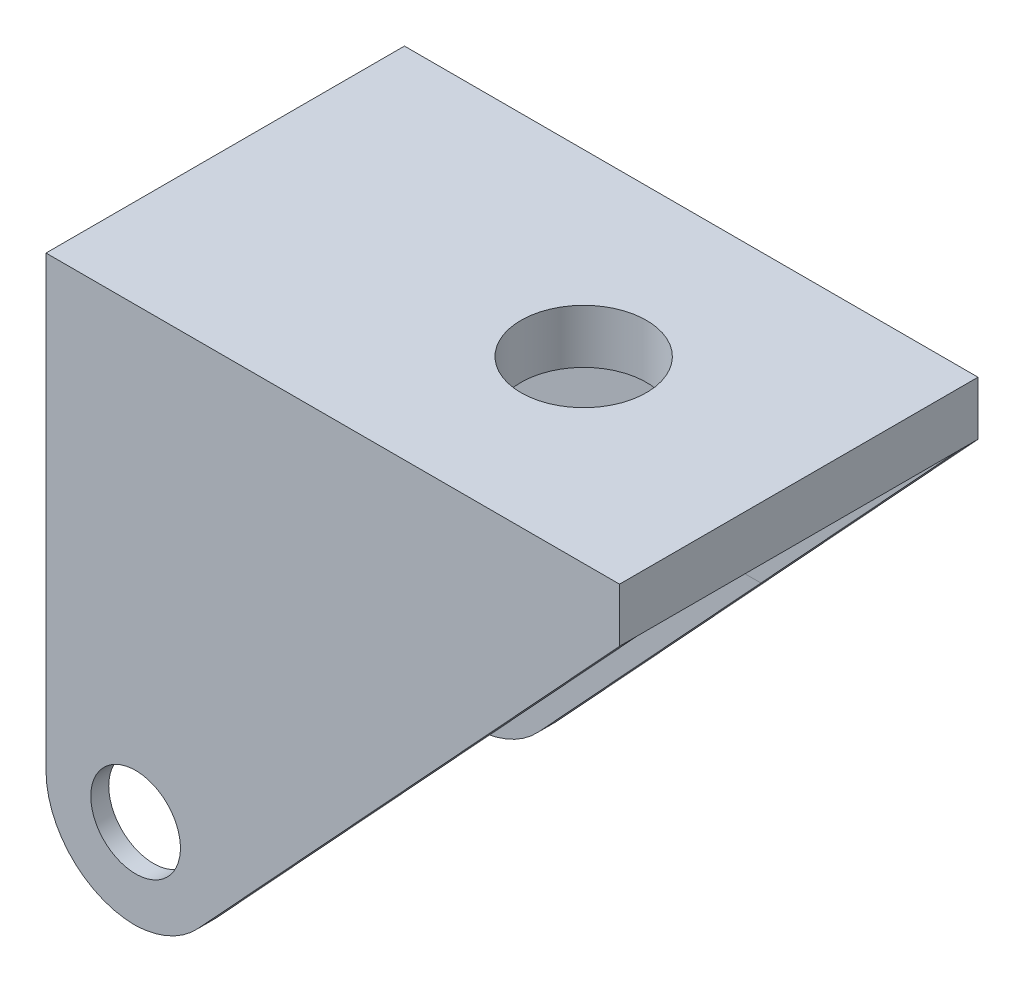
ISO-10303-21;
HEADER;
FILE_DESCRIPTION(('STEP AP214'),'2;1');
FILE_NAME('part.step','',(''),(''),'','','');
FILE_SCHEMA(('AUTOMOTIVE_DESIGN { 1 0 10303 214 1 1 1 1 }'));
ENDSEC;
DATA;
#1=APPLICATION_CONTEXT('core data for automotive mechanical design processes');
#2=APPLICATION_PROTOCOL_DEFINITION('international standard','automotive_design',2000,#1);
#3=PRODUCT_CONTEXT('',#1,'mechanical');
#4=PRODUCT('Part','Part','',(#3));
#5=PRODUCT_RELATED_PRODUCT_CATEGORY('part','',(#4));
#6=PRODUCT_DEFINITION_FORMATION('','',#4);
#7=PRODUCT_DEFINITION_CONTEXT('part definition',#1,'design');
#8=PRODUCT_DEFINITION('design','',#6,#7);
#9=PRODUCT_DEFINITION_SHAPE('','',#8);
#10=(LENGTH_UNIT() NAMED_UNIT(*) SI_UNIT(.MILLI.,.METRE.));
#11=(NAMED_UNIT(*) PLANE_ANGLE_UNIT() SI_UNIT($,.RADIAN.));
#12=(NAMED_UNIT(*) SI_UNIT($,.STERADIAN.) SOLID_ANGLE_UNIT());
#13=UNCERTAINTY_MEASURE_WITH_UNIT(LENGTH_MEASURE(1.E-05),#10,'distance_accuracy_value','');
#14=(GEOMETRIC_REPRESENTATION_CONTEXT(3) GLOBAL_UNCERTAINTY_ASSIGNED_CONTEXT((#13)) GLOBAL_UNIT_ASSIGNED_CONTEXT((#10,
#11,#12)) REPRESENTATION_CONTEXT('',''));
#15=CARTESIAN_POINT('',(0.,0.,0.));
#16=DIRECTION('',(0.,0.,1.));
#17=DIRECTION('',(1.,0.,0.));
#18=AXIS2_PLACEMENT_3D('',#15,#16,#17);
#19=CARTESIAN_POINT('',(16.,0.,0.));
#20=DIRECTION('',(1.,0.,0.));
#21=DIRECTION('',(0.,0.,-1.));
#22=AXIS2_PLACEMENT_3D('',#19,#20,#21);
#23=PLANE('',#22);
#24=DIRECTION('',(0.,0.,1.));
#25=VECTOR('',#24,1.);
#26=CARTESIAN_POINT('',(16.,12.,-94.0098539659698));
#27=LINE('',#26,#25);
#28=CARTESIAN_POINT('',(16.,12.,-9.99999999999999));
#29=VERTEX_POINT('',#28);
#30=CARTESIAN_POINT('',(16.,12.,-8.99999999999999));
#31=VERTEX_POINT('',#30);
#32=EDGE_CURVE('E129',#29,#31,#27,.T.);
#33=ORIENTED_EDGE('',*,*,#32,.F.);
#34=DIRECTION('',(0.,1.,0.));
#35=VECTOR('',#34,1.);
#36=CARTESIAN_POINT('',(16.,-15.,-10.));
#37=LINE('',#36,#35);
#38=CARTESIAN_POINT('',(16.,15.,-10.));
#39=VERTEX_POINT('',#38);
#40=EDGE_CURVE('E141',#29,#39,#37,.T.);
#41=ORIENTED_EDGE('',*,*,#40,.T.);
#42=DIRECTION('',(0.,0.,1.));
#43=VECTOR('',#42,1.);
#44=CARTESIAN_POINT('',(16.,15.,-10.));
#45=LINE('',#44,#43);
#46=CARTESIAN_POINT('',(16.,15.,10.));
#47=VERTEX_POINT('',#46);
#48=EDGE_CURVE('E153',#39,#47,#45,.T.);
#49=ORIENTED_EDGE('',*,*,#48,.T.);
#50=DIRECTION('',(0.,-1.,0.));
#51=VECTOR('',#50,1.);
#52=CARTESIAN_POINT('',(16.,-15.,10.));
#53=LINE('',#52,#51);
#54=CARTESIAN_POINT('',(16.,12.,10.));
#55=VERTEX_POINT('',#54);
#56=EDGE_CURVE('E154',#47,#55,#53,.T.);
#57=ORIENTED_EDGE('',*,*,#56,.T.);
#58=CARTESIAN_POINT('',(16.,12.,8.99999999999999));
#59=VERTEX_POINT('',#58);
#60=EDGE_CURVE('E147',#59,#55,#27,.T.);
#61=ORIENTED_EDGE('',*,*,#60,.F.);
#62=DIRECTION('',(0.,0.,-1.));
#63=VECTOR('',#62,1.);
#64=CARTESIAN_POINT('',(16.,12.,-9.));
#65=LINE('',#64,#63);
#66=EDGE_CURVE('E145',#59,#31,#65,.T.);
#67=ORIENTED_EDGE('',*,*,#66,.T.);
#68=EDGE_LOOP('',(#33,#41,#49,#57,#61,#67));
#69=FACE_BOUND('',#68,.T.);
#70=ADVANCED_FACE('F32',(#69),#23,.T.);
#71=CARTESIAN_POINT('',(16.,-15.,10.));
#72=DIRECTION('',(0.,0.,-1.));
#73=DIRECTION('',(-1.,0.,0.));
#74=AXIS2_PLACEMENT_3D('',#71,#72,#73);
#75=PLANE('',#74);
#76=CARTESIAN_POINT('',(-11.,-10.,10.));
#77=DIRECTION('',(0.,0.,-1.));
#78=DIRECTION('',(-1.,0.,0.));
#79=AXIS2_PLACEMENT_3D('',#76,#77,#78);
#80=CIRCLE('',#79,2.5);
#81=CARTESIAN_POINT('',(-13.5,-10.,10.));
#82=VERTEX_POINT('',#81);
#83=EDGE_CURVE('E180',#82,#82,#80,.T.);
#84=ORIENTED_EDGE('',*,*,#83,.T.);
#85=EDGE_LOOP('',(#84));
#86=FACE_BOUND('',#85,.T.);
#87=CARTESIAN_POINT('',(-11.,-10.,10.));
#88=DIRECTION('',(0.,0.,-1.));
#89=DIRECTION('',(-1.,0.,0.));
#90=AXIS2_PLACEMENT_3D('',#87,#88,#89);
#91=CIRCLE('',#90,5.);
#92=CARTESIAN_POINT('',(-16.,-10.,10.));
#93=VERTEX_POINT('',#92);
#94=CARTESIAN_POINT('',(-11.,-15.,10.));
#95=VERTEX_POINT('',#94);
#96=EDGE_CURVE('E202',#93,#95,#91,.F.);
#97=ORIENTED_EDGE('',*,*,#96,.T.);
#98=CARTESIAN_POINT('',(-11.1878498134461,-10.0035300013321,10.));
#99=DIRECTION('',(0.,0.,-1.));
#100=DIRECTION('',(-1.,0.,0.));
#101=AXIS2_PLACEMENT_3D('',#98,#99,#100);
#102=CIRCLE('',#101,5.);
#103=CARTESIAN_POINT('',(-7.51904644335522,-13.4005701588236,10.));
#104=VERTEX_POINT('',#103);
#105=EDGE_CURVE('E54',#95,#104,#102,.F.);
#106=ORIENTED_EDGE('',*,*,#105,.T.);
#107=DIRECTION('',(0.679408031498305,0.733760674018169,0.));
#108=VECTOR('',#107,1.);
#109=CARTESIAN_POINT('',(2.53988183161004,-2.53692762186115,10.));
#110=LINE('',#109,#108);
#111=EDGE_CURVE('E136',#104,#55,#110,.T.);
#112=ORIENTED_EDGE('',*,*,#111,.T.);
#113=ORIENTED_EDGE('',*,*,#56,.F.);
#114=DIRECTION('',(-1.,0.,0.));
#115=VECTOR('',#114,1.);
#116=CARTESIAN_POINT('',(16.,15.,10.));
#117=LINE('',#116,#115);
#118=CARTESIAN_POINT('',(-16.,15.,10.));
#119=VERTEX_POINT('',#118);
#120=EDGE_CURVE('E156',#47,#119,#117,.T.);
#121=ORIENTED_EDGE('',*,*,#120,.T.);
#122=DIRECTION('',(0.,-1.,0.));
#123=VECTOR('',#122,1.);
#124=CARTESIAN_POINT('',(-16.,-15.,10.));
#125=LINE('',#124,#123);
#126=EDGE_CURVE('E163',#119,#93,#125,.T.);
#127=ORIENTED_EDGE('',*,*,#126,.T.);
#128=EDGE_LOOP('',(#97,#106,#112,#113,#121,#127));
#129=FACE_BOUND('',#128,.T.);
#130=ADVANCED_FACE('F206',(#86,#129),#75,.F.);
#131=CARTESIAN_POINT('',(16.,-15.,-10.));
#132=DIRECTION('',(0.,0.,1.));
#133=DIRECTION('',(1.,0.,0.));
#134=AXIS2_PLACEMENT_3D('',#131,#132,#133);
#135=PLANE('',#134);
#136=CARTESIAN_POINT('',(-11.,-10.,-10.));
#137=DIRECTION('',(0.,0.,-1.));
#138=DIRECTION('',(-1.,0.,0.));
#139=AXIS2_PLACEMENT_3D('',#136,#137,#138);
#140=CIRCLE('',#139,2.5);
#141=CARTESIAN_POINT('',(-13.5,-10.,-10.));
#142=VERTEX_POINT('',#141);
#143=EDGE_CURVE('E262',#142,#142,#140,.T.);
#144=ORIENTED_EDGE('',*,*,#143,.F.);
#145=EDGE_LOOP('',(#144));
#146=FACE_BOUND('',#145,.T.);
#147=DIRECTION('',(-0.679408031498305,-0.733760674018169,0.));
#148=VECTOR('',#147,1.);
#149=CARTESIAN_POINT('',(2.53988183161005,-2.53692762186115,-10.));
#150=LINE('',#149,#148);
#151=CARTESIAN_POINT('',(-7.51904644335522,-13.4005701588236,-10.));
#152=VERTEX_POINT('',#151);
#153=EDGE_CURVE('E124',#29,#152,#150,.T.);
#154=ORIENTED_EDGE('',*,*,#153,.T.);
#155=CARTESIAN_POINT('',(-11.1878498134461,-10.0035300013321,-10.));
#156=DIRECTION('',(0.,0.,1.));
#157=DIRECTION('',(1.,0.,0.));
#158=AXIS2_PLACEMENT_3D('',#155,#156,#157);
#159=CIRCLE('',#158,5.);
#160=CARTESIAN_POINT('',(-11.,-15.,-10.));
#161=VERTEX_POINT('',#160);
#162=EDGE_CURVE('E193',#152,#161,#159,.F.);
#163=ORIENTED_EDGE('',*,*,#162,.T.);
#164=CARTESIAN_POINT('',(-11.,-9.99999999999999,-10.));
#165=DIRECTION('',(0.,0.,1.));
#166=DIRECTION('',(1.,0.,0.));
#167=AXIS2_PLACEMENT_3D('',#164,#165,#166);
#168=CIRCLE('',#167,5.);
#169=CARTESIAN_POINT('',(-16.,-9.99999999999999,-10.));
#170=VERTEX_POINT('',#169);
#171=EDGE_CURVE('E183',#161,#170,#168,.F.);
#172=ORIENTED_EDGE('',*,*,#171,.T.);
#173=DIRECTION('',(0.,1.,0.));
#174=VECTOR('',#173,1.);
#175=CARTESIAN_POINT('',(-16.,-15.,-10.));
#176=LINE('',#175,#174);
#177=CARTESIAN_POINT('',(-16.,15.,-10.));
#178=VERTEX_POINT('',#177);
#179=EDGE_CURVE('E166',#170,#178,#176,.T.);
#180=ORIENTED_EDGE('',*,*,#179,.T.);
#181=DIRECTION('',(-1.,0.,0.));
#182=VECTOR('',#181,1.);
#183=CARTESIAN_POINT('',(16.,15.,-10.));
#184=LINE('',#183,#182);
#185=EDGE_CURVE('E151',#39,#178,#184,.T.);
#186=ORIENTED_EDGE('',*,*,#185,.F.);
#187=ORIENTED_EDGE('',*,*,#40,.F.);
#188=EDGE_LOOP('',(#154,#163,#172,#180,#186,#187));
#189=FACE_BOUND('',#188,.T.);
#190=ADVANCED_FACE('F149',(#146,#189),#135,.F.);
#191=CARTESIAN_POINT('',(16.,15.,-10.));
#192=DIRECTION('',(0.,-1.,0.));
#193=DIRECTION('',(0.,0.,-1.));
#194=AXIS2_PLACEMENT_3D('',#191,#192,#193);
#195=PLANE('',#194);
#196=CARTESIAN_POINT('',(4.,15.,0.));
#197=DIRECTION('',(0.,1.,0.));
#198=DIRECTION('',(0.,0.,1.));
#199=AXIS2_PLACEMENT_3D('',#196,#197,#198);
#200=CIRCLE('',#199,3.5);
#201=CARTESIAN_POINT('',(4.,15.,3.50000000000001));
#202=VERTEX_POINT('',#201);
#203=EDGE_CURVE('E270',#202,#202,#200,.T.);
#204=ORIENTED_EDGE('',*,*,#203,.F.);
#205=EDGE_LOOP('',(#204));
#206=FACE_BOUND('',#205,.T.);
#207=DIRECTION('',(0.,0.,1.));
#208=VECTOR('',#207,1.);
#209=CARTESIAN_POINT('',(-16.,15.,-10.));
#210=LINE('',#209,#208);
#211=EDGE_CURVE('E159',#178,#119,#210,.T.);
#212=ORIENTED_EDGE('',*,*,#211,.T.);
#213=ORIENTED_EDGE('',*,*,#120,.F.);
#214=ORIENTED_EDGE('',*,*,#48,.F.);
#215=ORIENTED_EDGE('',*,*,#185,.T.);
#216=EDGE_LOOP('',(#212,#213,#214,#215));
#217=FACE_BOUND('',#216,.T.);
#218=ADVANCED_FACE('F277',(#206,#217),#195,.F.);
#219=CARTESIAN_POINT('',(-16.,0.,0.));
#220=DIRECTION('',(1.,0.,0.));
#221=DIRECTION('',(0.,0.,-1.));
#222=AXIS2_PLACEMENT_3D('',#219,#220,#221);
#223=PLANE('',#222);
#224=DIRECTION('',(0.,1.,0.));
#225=VECTOR('',#224,1.);
#226=CARTESIAN_POINT('',(-16.,0.,9.));
#227=LINE('',#226,#225);
#228=CARTESIAN_POINT('',(-16.,-10.,9.));
#229=VERTEX_POINT('',#228);
#230=CARTESIAN_POINT('',(-16.,0.,9.));
#231=VERTEX_POINT('',#230);
#232=EDGE_CURVE('E226',#229,#231,#227,.T.);
#233=ORIENTED_EDGE('',*,*,#232,.F.);
#234=DIRECTION('',(0.,0.,-1.));
#235=VECTOR('',#234,1.);
#236=CARTESIAN_POINT('',(-16.,-10.,0.));
#237=LINE('',#236,#235);
#238=EDGE_CURVE('E200',#229,#93,#237,.F.);
#239=ORIENTED_EDGE('',*,*,#238,.T.);
#240=ORIENTED_EDGE('',*,*,#126,.F.);
#241=ORIENTED_EDGE('',*,*,#211,.F.);
#242=ORIENTED_EDGE('',*,*,#179,.F.);
#243=DIRECTION('',(0.,0.,-1.));
#244=VECTOR('',#243,1.);
#245=CARTESIAN_POINT('',(-16.,-10.,0.));
#246=LINE('',#245,#244);
#247=CARTESIAN_POINT('',(-16.,-9.99999999999999,-9.));
#248=VERTEX_POINT('',#247);
#249=EDGE_CURVE('E185',#170,#248,#246,.F.);
#250=ORIENTED_EDGE('',*,*,#249,.T.);
#251=DIRECTION('',(0.,-1.,0.));
#252=VECTOR('',#251,1.);
#253=CARTESIAN_POINT('',(-16.,0.,-9.));
#254=LINE('',#253,#252);
#255=CARTESIAN_POINT('',(-16.,0.,-9.));
#256=VERTEX_POINT('',#255);
#257=EDGE_CURVE('E229',#256,#248,#254,.T.);
#258=ORIENTED_EDGE('',*,*,#257,.F.);
#259=DIRECTION('',(0.,-1.,0.));
#260=VECTOR('',#259,1.);
#261=CARTESIAN_POINT('',(-16.,0.,-9.));
#262=LINE('',#261,#260);
#263=CARTESIAN_POINT('',(-16.,12.,-9.));
#264=VERTEX_POINT('',#263);
#265=EDGE_CURVE('E237',#264,#256,#262,.T.);
#266=ORIENTED_EDGE('',*,*,#265,.F.);
#267=DIRECTION('',(0.,0.,-1.));
#268=VECTOR('',#267,1.);
#269=CARTESIAN_POINT('',(-16.,12.,-9.));
#270=LINE('',#269,#268);
#271=CARTESIAN_POINT('',(-16.,12.,9.));
#272=VERTEX_POINT('',#271);
#273=EDGE_CURVE('E234',#272,#264,#270,.T.);
#274=ORIENTED_EDGE('',*,*,#273,.F.);
#275=DIRECTION('',(0.,1.,0.));
#276=VECTOR('',#275,1.);
#277=CARTESIAN_POINT('',(-16.,12.,9.));
#278=LINE('',#277,#276);
#279=EDGE_CURVE('E231',#231,#272,#278,.T.);
#280=ORIENTED_EDGE('',*,*,#279,.F.);
#281=EDGE_LOOP('',(#233,#239,#240,#241,#242,#250,#258,#266,#274,#280));
#282=FACE_BOUND('',#281,.T.);
#283=ADVANCED_FACE('F280',(#282),#223,.F.);
#284=CARTESIAN_POINT('',(-76.2598539659698,0.,9.));
#285=DIRECTION('',(0.,0.,1.));
#286=DIRECTION('',(1.,0.,0.));
#287=AXIS2_PLACEMENT_3D('',#284,#285,#286);
#288=PLANE('',#287);
#289=CARTESIAN_POINT('',(-11.,-10.,9.));
#290=DIRECTION('',(0.,0.,1.));
#291=DIRECTION('',(1.,0.,0.));
#292=AXIS2_PLACEMENT_3D('',#289,#290,#291);
#293=CIRCLE('',#292,2.5);
#294=CARTESIAN_POINT('',(-13.5,-10.,9.));
#295=VERTEX_POINT('',#294);
#296=EDGE_CURVE('E179',#295,#295,#293,.T.);
#297=ORIENTED_EDGE('',*,*,#296,.T.);
#298=EDGE_LOOP('',(#297));
#299=FACE_BOUND('',#298,.T.);
#300=DIRECTION('',(-0.679408031498305,-0.733760674018169,0.));
#301=VECTOR('',#300,1.);
#302=CARTESIAN_POINT('',(-32.5689872442623,-40.4545062238032,9.));
#303=LINE('',#302,#301);
#304=CARTESIAN_POINT('',(4.88888888888887,0.,9.));
#305=VERTEX_POINT('',#304);
#306=CARTESIAN_POINT('',(-7.51904644335523,-13.4005701588236,9.00000000000001));
#307=VERTEX_POINT('',#306);
#308=EDGE_CURVE('E137',#305,#307,#303,.T.);
#309=ORIENTED_EDGE('',*,*,#308,.T.);
#310=CARTESIAN_POINT('',(-11.1878498134461,-10.0035300013321,9.00000000000001));
#311=DIRECTION('',(0.,0.,1.));
#312=DIRECTION('',(1.,0.,0.));
#313=AXIS2_PLACEMENT_3D('',#310,#311,#312);
#314=CIRCLE('',#313,5.);
#315=CARTESIAN_POINT('',(-11.,-15.,9.));
#316=VERTEX_POINT('',#315);
#317=EDGE_CURVE('E11',#307,#316,#314,.F.);
#318=ORIENTED_EDGE('',*,*,#317,.T.);
#319=CARTESIAN_POINT('',(-11.,-10.,9.));
#320=DIRECTION('',(0.,0.,1.));
#321=DIRECTION('',(1.,0.,0.));
#322=AXIS2_PLACEMENT_3D('',#319,#320,#321);
#323=CIRCLE('',#322,5.);
#324=EDGE_CURVE('E198',#316,#229,#323,.F.);
#325=ORIENTED_EDGE('',*,*,#324,.T.);
#326=ORIENTED_EDGE('',*,*,#232,.T.);
#327=DIRECTION('',(1.,0.,0.));
#328=VECTOR('',#327,1.);
#329=CARTESIAN_POINT('',(-76.2598539659698,0.,9.));
#330=LINE('',#329,#328);
#331=EDGE_CURVE('E167',#231,#305,#330,.T.);
#332=ORIENTED_EDGE('',*,*,#331,.T.);
#333=EDGE_LOOP('',(#309,#318,#325,#326,#332));
#334=FACE_BOUND('',#333,.T.);
#335=ADVANCED_FACE('F215',(#299,#334),#288,.F.);
#336=CARTESIAN_POINT('',(-76.2598539659698,12.,9.));
#337=DIRECTION('',(0.,0.,1.));
#338=DIRECTION('',(0.,-1.,0.));
#339=AXIS2_PLACEMENT_3D('',#336,#337,#338);
#340=PLANE('',#339);
#341=DIRECTION('',(1.,0.,0.));
#342=VECTOR('',#341,1.);
#343=CARTESIAN_POINT('',(-76.2598539659698,12.,9.));
#344=LINE('',#343,#342);
#345=EDGE_CURVE('E246',#272,#59,#344,.T.);
#346=ORIENTED_EDGE('',*,*,#345,.T.);
#347=DIRECTION('',(-0.679408031498305,-0.733760674018169,0.));
#348=VECTOR('',#347,1.);
#349=CARTESIAN_POINT('',(-26.5867125027556,-33.993649502976,9.00000000000001));
#350=LINE('',#349,#348);
#351=EDGE_CURVE('E220',#59,#305,#350,.T.);
#352=ORIENTED_EDGE('',*,*,#351,.T.);
#353=ORIENTED_EDGE('',*,*,#331,.F.);
#354=ORIENTED_EDGE('',*,*,#279,.T.);
#355=EDGE_LOOP('',(#346,#352,#353,#354));
#356=FACE_BOUND('',#355,.T.);
#357=ADVANCED_FACE('F249',(#356),#340,.F.);
#358=CARTESIAN_POINT('',(-76.2598539659698,12.,-9.));
#359=DIRECTION('',(0.,1.,0.));
#360=DIRECTION('',(0.,0.,1.));
#361=AXIS2_PLACEMENT_3D('',#358,#359,#360);
#362=PLANE('',#361);
#363=CARTESIAN_POINT('',(4.,12.,0.));
#364=DIRECTION('',(0.,1.,0.));
#365=DIRECTION('',(0.,0.,1.));
#366=AXIS2_PLACEMENT_3D('',#363,#364,#365);
#367=CIRCLE('',#366,3.5);
#368=CARTESIAN_POINT('',(4.,12.,3.5));
#369=VERTEX_POINT('',#368);
#370=EDGE_CURVE('E265',#369,#369,#367,.F.);
#371=ORIENTED_EDGE('',*,*,#370,.F.);
#372=EDGE_LOOP('',(#371));
#373=FACE_BOUND('',#372,.T.);
#374=ORIENTED_EDGE('',*,*,#273,.T.);
#375=DIRECTION('',(1.,0.,0.));
#376=VECTOR('',#375,1.);
#377=CARTESIAN_POINT('',(-76.2598539659698,12.,-9.));
#378=LINE('',#377,#376);
#379=EDGE_CURVE('E243',#264,#31,#378,.T.);
#380=ORIENTED_EDGE('',*,*,#379,.T.);
#381=ORIENTED_EDGE('',*,*,#66,.F.);
#382=ORIENTED_EDGE('',*,*,#345,.F.);
#383=EDGE_LOOP('',(#374,#380,#381,#382));
#384=FACE_BOUND('',#383,.T.);
#385=ADVANCED_FACE('F253',(#373,#384),#362,.F.);
#386=CARTESIAN_POINT('',(-76.2598539659698,0.,-9.));
#387=DIRECTION('',(0.,0.,-1.));
#388=DIRECTION('',(-1.,0.,0.));
#389=AXIS2_PLACEMENT_3D('',#386,#387,#388);
#390=PLANE('',#389);
#391=DIRECTION('',(1.,0.,0.));
#392=VECTOR('',#391,1.);
#393=CARTESIAN_POINT('',(-76.2598539659698,0.,-9.));
#394=LINE('',#393,#392);
#395=CARTESIAN_POINT('',(4.88888888888887,0.,-9.));
#396=VERTEX_POINT('',#395);
#397=EDGE_CURVE('E228',#256,#396,#394,.T.);
#398=ORIENTED_EDGE('',*,*,#397,.T.);
#399=DIRECTION('',(0.679408031498305,0.733760674018169,0.));
#400=VECTOR('',#399,1.);
#401=CARTESIAN_POINT('',(-32.5689872442623,-40.4545062238032,-9.));
#402=LINE('',#401,#400);
#403=EDGE_CURVE('E146',#396,#31,#402,.T.);
#404=ORIENTED_EDGE('',*,*,#403,.T.);
#405=ORIENTED_EDGE('',*,*,#379,.F.);
#406=ORIENTED_EDGE('',*,*,#265,.T.);
#407=EDGE_LOOP('',(#398,#404,#405,#406));
#408=FACE_BOUND('',#407,.T.);
#409=ADVANCED_FACE('F256',(#408),#390,.F.);
#410=CARTESIAN_POINT('',(-76.2598539659698,0.,-9.));
#411=DIRECTION('',(0.,0.,-1.));
#412=DIRECTION('',(-1.,0.,0.));
#413=AXIS2_PLACEMENT_3D('',#410,#411,#412);
#414=PLANE('',#413);
#415=CARTESIAN_POINT('',(-11.,-10.,-9.));
#416=DIRECTION('',(0.,0.,-1.));
#417=DIRECTION('',(-1.,0.,0.));
#418=AXIS2_PLACEMENT_3D('',#415,#416,#417);
#419=CIRCLE('',#418,2.5);
#420=CARTESIAN_POINT('',(-13.5,-10.,-9.));
#421=VERTEX_POINT('',#420);
#422=EDGE_CURVE('E176',#421,#421,#419,.T.);
#423=ORIENTED_EDGE('',*,*,#422,.T.);
#424=EDGE_LOOP('',(#423));
#425=FACE_BOUND('',#424,.T.);
#426=CARTESIAN_POINT('',(-11.,-9.99999999999999,-9.));
#427=DIRECTION('',(0.,0.,-1.));
#428=DIRECTION('',(-1.,0.,0.));
#429=AXIS2_PLACEMENT_3D('',#426,#427,#428);
#430=CIRCLE('',#429,5.);
#431=CARTESIAN_POINT('',(-11.,-15.,-9.));
#432=VERTEX_POINT('',#431);
#433=EDGE_CURVE('E187',#248,#432,#430,.F.);
#434=ORIENTED_EDGE('',*,*,#433,.T.);
#435=CARTESIAN_POINT('',(-11.1878498134461,-10.0035300013321,-9.));
#436=DIRECTION('',(0.,0.,-1.));
#437=DIRECTION('',(-1.,0.,0.));
#438=AXIS2_PLACEMENT_3D('',#435,#436,#437);
#439=CIRCLE('',#438,5.);
#440=CARTESIAN_POINT('',(-7.51904644335523,-13.4005701588236,-9.));
#441=VERTEX_POINT('',#440);
#442=EDGE_CURVE('E190',#432,#441,#439,.F.);
#443=ORIENTED_EDGE('',*,*,#442,.T.);
#444=DIRECTION('',(0.679408031498305,0.733760674018169,0.));
#445=VECTOR('',#444,1.);
#446=CARTESIAN_POINT('',(-32.5689872442623,-40.4545062238032,-9.));
#447=LINE('',#446,#445);
#448=EDGE_CURVE('E173',#441,#396,#447,.T.);
#449=ORIENTED_EDGE('',*,*,#448,.T.);
#450=ORIENTED_EDGE('',*,*,#397,.F.);
#451=ORIENTED_EDGE('',*,*,#257,.T.);
#452=EDGE_LOOP('',(#434,#443,#449,#450,#451));
#453=FACE_BOUND('',#452,.T.);
#454=ADVANCED_FACE('F291',(#425,#453),#414,.F.);
#455=CARTESIAN_POINT('',(16.,12.,-94.0098539659698));
#456=DIRECTION('',(-0.733760674018169,0.679408031498305,0.));
#457=DIRECTION('',(-0.679408031498305,-0.733760674018169,0.));
#458=AXIS2_PLACEMENT_3D('',#455,#456,#457);
#459=PLANE('',#458);
#460=ORIENTED_EDGE('',*,*,#448,.F.);
#461=DIRECTION('',(0.,0.,-1.));
#462=VECTOR('',#461,1.);
#463=CARTESIAN_POINT('',(-7.51904644335521,-13.4005701588236,-94.0098539659698));
#464=LINE('',#463,#462);
#465=EDGE_CURVE('E132',#441,#152,#464,.T.);
#466=ORIENTED_EDGE('',*,*,#465,.T.);
#467=ORIENTED_EDGE('',*,*,#153,.F.);
#468=ORIENTED_EDGE('',*,*,#32,.T.);
#469=ORIENTED_EDGE('',*,*,#403,.F.);
#470=EDGE_LOOP('',(#460,#466,#467,#468,#469));
#471=FACE_BOUND('',#470,.T.);
#472=ADVANCED_FACE('F127',(#471),#459,.F.);
#473=ORIENTED_EDGE('',*,*,#111,.F.);
#474=DIRECTION('',(0.,0.,-1.));
#475=VECTOR('',#474,1.);
#476=CARTESIAN_POINT('',(-7.5190464433552,-13.4005701588236,-94.0098539659698));
#477=LINE('',#476,#475);
#478=EDGE_CURVE('E40',#104,#307,#477,.T.);
#479=ORIENTED_EDGE('',*,*,#478,.T.);
#480=ORIENTED_EDGE('',*,*,#308,.F.);
#481=ORIENTED_EDGE('',*,*,#351,.F.);
#482=ORIENTED_EDGE('',*,*,#60,.T.);
#483=EDGE_LOOP('',(#473,#479,#480,#481,#482));
#484=FACE_BOUND('',#483,.T.);
#485=ADVANCED_FACE('F327',(#484),#459,.F.);
#486=CARTESIAN_POINT('',(-11.,-10.,10.));
#487=DIRECTION('',(0.,0.,-1.));
#488=DIRECTION('',(-1.,0.,0.));
#489=AXIS2_PLACEMENT_3D('',#486,#487,#488);
#490=CYLINDRICAL_SURFACE('',#489,2.5);
#491=CARTESIAN_POINT('',(-13.5,-10.,-10.));
#492=CARTESIAN_POINT('',(-13.5,-10.,-9.98958333333333));
#493=CARTESIAN_POINT('',(-13.5,-10.,-9.97916666666667));
#494=CARTESIAN_POINT('',(-13.5,-10.,-9.95833333333333));
#495=CARTESIAN_POINT('',(-13.5,-10.,-9.94791666666667));
#496=CARTESIAN_POINT('',(-13.5,-10.,-9.92708333333333));
#497=CARTESIAN_POINT('',(-13.5,-10.,-9.91666666666667));
#498=CARTESIAN_POINT('',(-13.5,-10.,-9.89583333333333));
#499=CARTESIAN_POINT('',(-13.5,-10.,-9.88541666666667));
#500=CARTESIAN_POINT('',(-13.5,-10.,-9.86458333333333));
#501=CARTESIAN_POINT('',(-13.5,-10.,-9.85416666666667));
#502=CARTESIAN_POINT('',(-13.5,-10.,-9.83333333333333));
#503=CARTESIAN_POINT('',(-13.5,-10.,-9.82291666666667));
#504=CARTESIAN_POINT('',(-13.5,-10.,-9.80208333333333));
#505=CARTESIAN_POINT('',(-13.5,-10.,-9.79166666666667));
#506=CARTESIAN_POINT('',(-13.5,-10.,-9.77083333333333));
#507=CARTESIAN_POINT('',(-13.5,-10.,-9.76041666666667));
#508=CARTESIAN_POINT('',(-13.5,-10.,-9.73958333333333));
#509=CARTESIAN_POINT('',(-13.5,-10.,-9.72916666666667));
#510=CARTESIAN_POINT('',(-13.5,-10.,-9.70833333333333));
#511=CARTESIAN_POINT('',(-13.5,-10.,-9.69791666666667));
#512=CARTESIAN_POINT('',(-13.5,-10.,-9.67708333333333));
#513=CARTESIAN_POINT('',(-13.5,-10.,-9.66666666666667));
#514=CARTESIAN_POINT('',(-13.5,-10.,-9.64583333333333));
#515=CARTESIAN_POINT('',(-13.5,-10.,-9.63541666666667));
#516=CARTESIAN_POINT('',(-13.5,-10.,-9.61458333333333));
#517=CARTESIAN_POINT('',(-13.5,-10.,-9.60416666666667));
#518=CARTESIAN_POINT('',(-13.5,-10.,-9.58333333333333));
#519=CARTESIAN_POINT('',(-13.5,-10.,-9.57291666666667));
#520=CARTESIAN_POINT('',(-13.5,-10.,-9.55208333333333));
#521=CARTESIAN_POINT('',(-13.5,-10.,-9.54166666666667));
#522=CARTESIAN_POINT('',(-13.5,-10.,-9.52083333333333));
#523=CARTESIAN_POINT('',(-13.5,-10.,-9.51041666666667));
#524=CARTESIAN_POINT('',(-13.5,-10.,-9.48958333333333));
#525=CARTESIAN_POINT('',(-13.5,-10.,-9.47916666666667));
#526=CARTESIAN_POINT('',(-13.5,-10.,-9.45833333333333));
#527=CARTESIAN_POINT('',(-13.5,-10.,-9.44791666666667));
#528=CARTESIAN_POINT('',(-13.5,-10.,-9.42708333333333));
#529=CARTESIAN_POINT('',(-13.5,-10.,-9.41666666666667));
#530=CARTESIAN_POINT('',(-13.5,-10.,-9.39583333333333));
#531=CARTESIAN_POINT('',(-13.5,-10.,-9.38541666666666));
#532=CARTESIAN_POINT('',(-13.5,-10.,-9.36458333333333));
#533=CARTESIAN_POINT('',(-13.5,-10.,-9.35416666666666));
#534=CARTESIAN_POINT('',(-13.5,-10.,-9.33333333333333));
#535=CARTESIAN_POINT('',(-13.5,-10.,-9.32291666666666));
#536=CARTESIAN_POINT('',(-13.5,-10.,-9.30208333333333));
#537=CARTESIAN_POINT('',(-13.5,-10.,-9.29166666666666));
#538=CARTESIAN_POINT('',(-13.5,-10.,-9.27083333333333));
#539=CARTESIAN_POINT('',(-13.5,-10.,-9.26041666666666));
#540=CARTESIAN_POINT('',(-13.5,-10.,-9.23958333333333));
#541=CARTESIAN_POINT('',(-13.5,-10.,-9.22916666666666));
#542=CARTESIAN_POINT('',(-13.5,-10.,-9.20833333333333));
#543=CARTESIAN_POINT('',(-13.5,-10.,-9.19791666666666));
#544=CARTESIAN_POINT('',(-13.5,-10.,-9.17708333333333));
#545=CARTESIAN_POINT('',(-13.5,-10.,-9.16666666666666));
#546=CARTESIAN_POINT('',(-13.5,-10.,-9.14583333333333));
#547=CARTESIAN_POINT('',(-13.5,-10.,-9.13541666666666));
#548=CARTESIAN_POINT('',(-13.5,-10.,-9.11458333333333));
#549=CARTESIAN_POINT('',(-13.5,-10.,-9.10416666666666));
#550=CARTESIAN_POINT('',(-13.5,-10.,-9.08333333333333));
#551=CARTESIAN_POINT('',(-13.5,-10.,-9.07291666666666));
#552=CARTESIAN_POINT('',(-13.5,-10.,-9.05208333333333));
#553=CARTESIAN_POINT('',(-13.5,-10.,-9.04166666666666));
#554=CARTESIAN_POINT('',(-13.5,-10.,-9.02083333333333));
#555=CARTESIAN_POINT('',(-13.5,-10.,-9.01041666666666));
#556=CARTESIAN_POINT('',(-13.5,-10.,-9.));
#557=B_SPLINE_CURVE_WITH_KNOTS('',3,(#491,#492,#493,#494,#495,#496,#497,#498,#499,#500,#501,
#502,#503,#504,#505,#506,#507,#508,#509,#510,#511,#512,#513,#514,#515,#516,#517,#518,#519,#520,
#521,#522,#523,#524,#525,#526,#527,#528,#529,#530,#531,#532,#533,#534,#535,#536,#537,#538,#539,
#540,#541,#542,#543,#544,#545,#546,#547,#548,#549,#550,#551,#552,#553,#554,#555,#556),
.UNSPECIFIED.,.F.,.F.,(4,2,2,2,2,2,2,2,2,2,2,2,2,2,2,2,2,2,2,2,2,2,2,2,2,2,2,2,2,2,2,2,4),(0.,
0.03125,0.0625000000000001,0.0937500000000001,0.125,0.15625,0.1875,0.21875,0.25,0.28125,0.3125,
0.34375,0.375,0.40625,0.4375,0.46875,0.5,0.53125,0.5625,0.593750000000001,0.625000000000001,
0.656250000000001,0.687500000000001,0.718750000000001,0.750000000000001,0.781250000000001,
0.812500000000001,0.843750000000001,0.875000000000001,0.906250000000001,0.937500000000001,
0.968750000000001,1.),.UNSPECIFIED.);
#558=EDGE_CURVE('BSEAM324',#142,#421,#557,.T.);
#559=ORIENTED_EDGE('',*,*,#143,.T.);
#560=ORIENTED_EDGE('',*,*,#422,.F.);
#561=ORIENTED_EDGE('',*,*,#558,.T.);
#562=ORIENTED_EDGE('',*,*,#558,.F.);
#563=EDGE_LOOP('',(#559,#561,#560,#562));
#564=FACE_BOUND('',#563,.T.);
#565=ADVANCED_FACE('F324',(#564),#490,.F.);
#566=CARTESIAN_POINT('',(-13.5,-10.,10.));
#567=CARTESIAN_POINT('',(-13.5,-10.,9.98958333333334));
#568=CARTESIAN_POINT('',(-13.5,-10.,9.97916666666668));
#569=CARTESIAN_POINT('',(-13.5,-10.,9.95833333333334));
#570=CARTESIAN_POINT('',(-13.5,-10.,9.94791666666668));
#571=CARTESIAN_POINT('',(-13.5,-10.,9.92708333333334));
#572=CARTESIAN_POINT('',(-13.5,-10.,9.91666666666668));
#573=CARTESIAN_POINT('',(-13.5,-10.,9.89583333333334));
#574=CARTESIAN_POINT('',(-13.5,-10.,9.88541666666668));
#575=CARTESIAN_POINT('',(-13.5,-10.,9.86458333333334));
#576=CARTESIAN_POINT('',(-13.5,-10.,9.85416666666668));
#577=CARTESIAN_POINT('',(-13.5,-10.,9.83333333333334));
#578=CARTESIAN_POINT('',(-13.5,-10.,9.82291666666668));
#579=CARTESIAN_POINT('',(-13.5,-10.,9.80208333333334));
#580=CARTESIAN_POINT('',(-13.5,-10.,9.79166666666668));
#581=CARTESIAN_POINT('',(-13.5,-10.,9.77083333333334));
#582=CARTESIAN_POINT('',(-13.5,-10.,9.76041666666668));
#583=CARTESIAN_POINT('',(-13.5,-10.,9.73958333333334));
#584=CARTESIAN_POINT('',(-13.5,-10.,9.72916666666667));
#585=CARTESIAN_POINT('',(-13.5,-10.,9.70833333333334));
#586=CARTESIAN_POINT('',(-13.5,-10.,9.69791666666667));
#587=CARTESIAN_POINT('',(-13.5,-10.,9.67708333333334));
#588=CARTESIAN_POINT('',(-13.5,-10.,9.66666666666667));
#589=CARTESIAN_POINT('',(-13.5,-10.,9.64583333333334));
#590=CARTESIAN_POINT('',(-13.5,-10.,9.63541666666667));
#591=CARTESIAN_POINT('',(-13.5,-10.,9.61458333333334));
#592=CARTESIAN_POINT('',(-13.5,-10.,9.60416666666667));
#593=CARTESIAN_POINT('',(-13.5,-10.,9.58333333333334));
#594=CARTESIAN_POINT('',(-13.5,-10.,9.57291666666667));
#595=CARTESIAN_POINT('',(-13.5,-10.,9.55208333333334));
#596=CARTESIAN_POINT('',(-13.5,-10.,9.54166666666667));
#597=CARTESIAN_POINT('',(-13.5,-10.,9.52083333333334));
#598=CARTESIAN_POINT('',(-13.5,-10.,9.51041666666667));
#599=CARTESIAN_POINT('',(-13.5,-10.,9.48958333333334));
#600=CARTESIAN_POINT('',(-13.5,-10.,9.47916666666667));
#601=CARTESIAN_POINT('',(-13.5,-10.,9.45833333333334));
#602=CARTESIAN_POINT('',(-13.5,-10.,9.44791666666667));
#603=CARTESIAN_POINT('',(-13.5,-10.,9.42708333333334));
#604=CARTESIAN_POINT('',(-13.5,-10.,9.41666666666667));
#605=CARTESIAN_POINT('',(-13.5,-10.,9.39583333333334));
#606=CARTESIAN_POINT('',(-13.5,-10.,9.38541666666667));
#607=CARTESIAN_POINT('',(-13.5,-10.,9.36458333333334));
#608=CARTESIAN_POINT('',(-13.5,-10.,9.35416666666667));
#609=CARTESIAN_POINT('',(-13.5,-10.,9.33333333333334));
#610=CARTESIAN_POINT('',(-13.5,-10.,9.32291666666667));
#611=CARTESIAN_POINT('',(-13.5,-10.,9.30208333333334));
#612=CARTESIAN_POINT('',(-13.5,-10.,9.29166666666667));
#613=CARTESIAN_POINT('',(-13.5,-10.,9.27083333333334));
#614=CARTESIAN_POINT('',(-13.5,-10.,9.26041666666667));
#615=CARTESIAN_POINT('',(-13.5,-10.,9.23958333333334));
#616=CARTESIAN_POINT('',(-13.5,-10.,9.22916666666667));
#617=CARTESIAN_POINT('',(-13.5,-10.,9.20833333333334));
#618=CARTESIAN_POINT('',(-13.5,-10.,9.19791666666667));
#619=CARTESIAN_POINT('',(-13.5,-10.,9.17708333333334));
#620=CARTESIAN_POINT('',(-13.5,-10.,9.16666666666667));
#621=CARTESIAN_POINT('',(-13.5,-10.,9.14583333333334));
#622=CARTESIAN_POINT('',(-13.5,-10.,9.13541666666667));
#623=CARTESIAN_POINT('',(-13.5,-10.,9.11458333333334));
#624=CARTESIAN_POINT('',(-13.5,-10.,9.10416666666667));
#625=CARTESIAN_POINT('',(-13.5,-10.,9.08333333333334));
#626=CARTESIAN_POINT('',(-13.5,-10.,9.07291666666667));
#627=CARTESIAN_POINT('',(-13.5,-10.,9.05208333333334));
#628=CARTESIAN_POINT('',(-13.5,-10.,9.04166666666667));
#629=CARTESIAN_POINT('',(-13.5,-10.,9.02083333333334));
#630=CARTESIAN_POINT('',(-13.5,-10.,9.01041666666667));
#631=CARTESIAN_POINT('',(-13.5,-10.,9.));
#632=B_SPLINE_CURVE_WITH_KNOTS('',3,(#566,#567,#568,#569,#570,#571,#572,#573,#574,#575,#576,
#577,#578,#579,#580,#581,#582,#583,#584,#585,#586,#587,#588,#589,#590,#591,#592,#593,#594,#595,
#596,#597,#598,#599,#600,#601,#602,#603,#604,#605,#606,#607,#608,#609,#610,#611,#612,#613,#614,
#615,#616,#617,#618,#619,#620,#621,#622,#623,#624,#625,#626,#627,#628,#629,#630,#631),
.UNSPECIFIED.,.F.,.F.,(4,2,2,2,2,2,2,2,2,2,2,2,2,2,2,2,2,2,2,2,2,2,2,2,2,2,2,2,2,2,2,2,4),(0.,
0.0312500000000018,0.0625000000000018,0.0937500000000018,0.125000000000002,0.156250000000002,
0.187500000000002,0.218750000000002,0.250000000000002,0.281250000000004,0.312500000000004,
0.343750000000004,0.375000000000004,0.406250000000004,0.437500000000004,0.468750000000004,
0.500000000000004,0.531250000000006,0.562500000000006,0.593750000000006,0.625000000000006,
0.656250000000006,0.687500000000006,0.718750000000006,0.750000000000006,0.781250000000008,
0.812500000000008,0.843750000000008,0.875000000000008,0.906250000000008,0.937500000000008,
0.968750000000008,1.00000000000001),.UNSPECIFIED.);
#633=EDGE_CURVE('BSEAM304',#82,#295,#632,.T.);
#634=ORIENTED_EDGE('',*,*,#83,.F.);
#635=ORIENTED_EDGE('',*,*,#296,.F.);
#636=ORIENTED_EDGE('',*,*,#633,.T.);
#637=ORIENTED_EDGE('',*,*,#633,.F.);
#638=EDGE_LOOP('',(#634,#636,#635,#637));
#639=FACE_BOUND('',#638,.T.);
#640=ADVANCED_FACE('F304',(#639),#490,.F.);
#641=CARTESIAN_POINT('',(-11.,-9.99999999999999,-10.));
#642=DIRECTION('',(0.,0.,-1.));
#643=DIRECTION('',(0.,1.,0.));
#644=AXIS2_PLACEMENT_3D('',#641,#642,#643);
#645=CYLINDRICAL_SURFACE('',#644,5.);
#646=ORIENTED_EDGE('',*,*,#433,.F.);
#647=ORIENTED_EDGE('',*,*,#249,.F.);
#648=ORIENTED_EDGE('',*,*,#171,.F.);
#649=DIRECTION('',(0.,0.,-1.));
#650=VECTOR('',#649,1.);
#651=CARTESIAN_POINT('',(-11.,-15.,-10.));
#652=LINE('',#651,#650);
#653=EDGE_CURVE('E175',#432,#161,#652,.T.);
#654=ORIENTED_EDGE('',*,*,#653,.F.);
#655=EDGE_LOOP('',(#646,#647,#648,#654));
#656=FACE_BOUND('',#655,.T.);
#657=ADVANCED_FACE('F294',(#656),#645,.T.);
#658=CARTESIAN_POINT('',(-11.1878498134461,-10.0035300013321,-10.));
#659=DIRECTION('',(0.,0.,-1.));
#660=DIRECTION('',(0.,1.,0.));
#661=AXIS2_PLACEMENT_3D('',#658,#659,#660);
#662=CYLINDRICAL_SURFACE('',#661,5.);
#663=ORIENTED_EDGE('',*,*,#162,.F.);
#664=ORIENTED_EDGE('',*,*,#465,.F.);
#665=ORIENTED_EDGE('',*,*,#442,.F.);
#666=ORIENTED_EDGE('',*,*,#653,.T.);
#667=EDGE_LOOP('',(#663,#664,#665,#666));
#668=FACE_BOUND('',#667,.T.);
#669=ADVANCED_FACE('F297',(#668),#662,.T.);
#670=CARTESIAN_POINT('',(-11.,-9.99999999999999,-10.));
#671=DIRECTION('',(0.,0.,-1.));
#672=DIRECTION('',(0.,1.,0.));
#673=AXIS2_PLACEMENT_3D('',#670,#671,#672);
#674=CYLINDRICAL_SURFACE('',#673,5.);
#675=ORIENTED_EDGE('',*,*,#96,.F.);
#676=ORIENTED_EDGE('',*,*,#238,.F.);
#677=ORIENTED_EDGE('',*,*,#324,.F.);
#678=DIRECTION('',(0.,0.,-1.));
#679=VECTOR('',#678,1.);
#680=CARTESIAN_POINT('',(-11.,-15.,-10.));
#681=LINE('',#680,#679);
#682=EDGE_CURVE('E195',#95,#316,#681,.T.);
#683=ORIENTED_EDGE('',*,*,#682,.F.);
#684=EDGE_LOOP('',(#675,#676,#677,#683));
#685=FACE_BOUND('',#684,.T.);
#686=ADVANCED_FACE('F211',(#685),#674,.T.);
#687=CARTESIAN_POINT('',(-11.1878498134461,-10.0035300013321,-10.));
#688=DIRECTION('',(0.,0.,-1.));
#689=DIRECTION('',(0.,1.,0.));
#690=AXIS2_PLACEMENT_3D('',#687,#688,#689);
#691=CYLINDRICAL_SURFACE('',#690,5.);
#692=ORIENTED_EDGE('',*,*,#317,.F.);
#693=ORIENTED_EDGE('',*,*,#478,.F.);
#694=ORIENTED_EDGE('',*,*,#105,.F.);
#695=ORIENTED_EDGE('',*,*,#682,.T.);
#696=EDGE_LOOP('',(#692,#693,#694,#695));
#697=FACE_BOUND('',#696,.T.);
#698=ADVANCED_FACE('F34',(#697),#691,.T.);
#699=CARTESIAN_POINT('',(4.,-15.001,0.));
#700=DIRECTION('',(0.,1.,0.));
#701=DIRECTION('',(0.,0.,1.));
#702=AXIS2_PLACEMENT_3D('',#699,#700,#701);
#703=CYLINDRICAL_SURFACE('',#702,3.5);
#704=CARTESIAN_POINT('',(4.,15.,3.50000000000001));
#705=CARTESIAN_POINT('',(4.,14.96875,3.50000000000001));
#706=CARTESIAN_POINT('',(4.,14.9375,3.50000000000001));
#707=CARTESIAN_POINT('',(4.,14.875,3.50000000000001));
#708=CARTESIAN_POINT('',(4.,14.84375,3.50000000000001));
#709=CARTESIAN_POINT('',(4.,14.78125,3.50000000000001));
#710=CARTESIAN_POINT('',(4.,14.75,3.50000000000001));
#711=CARTESIAN_POINT('',(4.,14.6875,3.50000000000001));
#712=CARTESIAN_POINT('',(4.,14.65625,3.50000000000001));
#713=CARTESIAN_POINT('',(4.,14.59375,3.50000000000001));
#714=CARTESIAN_POINT('',(4.,14.5625,3.50000000000001));
#715=CARTESIAN_POINT('',(4.,14.5,3.50000000000001));
#716=CARTESIAN_POINT('',(4.,14.46875,3.50000000000001));
#717=CARTESIAN_POINT('',(4.,14.40625,3.50000000000001));
#718=CARTESIAN_POINT('',(4.,14.375,3.50000000000001));
#719=CARTESIAN_POINT('',(4.,14.3125,3.50000000000001));
#720=CARTESIAN_POINT('',(4.,14.28125,3.50000000000001));
#721=CARTESIAN_POINT('',(4.,14.21875,3.50000000000001));
#722=CARTESIAN_POINT('',(4.,14.1875,3.5));
#723=CARTESIAN_POINT('',(4.,14.125,3.5));
#724=CARTESIAN_POINT('',(4.,14.09375,3.5));
#725=CARTESIAN_POINT('',(4.,14.03125,3.5));
#726=CARTESIAN_POINT('',(4.,14.,3.5));
#727=CARTESIAN_POINT('',(4.,13.9375,3.5));
#728=CARTESIAN_POINT('',(4.,13.90625,3.5));
#729=CARTESIAN_POINT('',(4.,13.84375,3.5));
#730=CARTESIAN_POINT('',(4.,13.8125,3.5));
#731=CARTESIAN_POINT('',(4.,13.75,3.5));
#732=CARTESIAN_POINT('',(4.,13.71875,3.5));
#733=CARTESIAN_POINT('',(4.,13.65625,3.5));
#734=CARTESIAN_POINT('',(4.,13.625,3.5));
#735=CARTESIAN_POINT('',(4.,13.5625,3.5));
#736=CARTESIAN_POINT('',(4.,13.53125,3.5));
#737=CARTESIAN_POINT('',(4.,13.46875,3.5));
#738=CARTESIAN_POINT('',(4.,13.4375,3.5));
#739=CARTESIAN_POINT('',(4.,13.375,3.5));
#740=CARTESIAN_POINT('',(4.,13.34375,3.5));
#741=CARTESIAN_POINT('',(4.,13.28125,3.5));
#742=CARTESIAN_POINT('',(4.,13.25,3.5));
#743=CARTESIAN_POINT('',(4.,13.1875,3.5));
#744=CARTESIAN_POINT('',(4.,13.15625,3.5));
#745=CARTESIAN_POINT('',(4.,13.09375,3.5));
#746=CARTESIAN_POINT('',(4.,13.0625,3.5));
#747=CARTESIAN_POINT('',(4.,13.,3.5));
#748=CARTESIAN_POINT('',(4.,12.96875,3.5));
#749=CARTESIAN_POINT('',(4.,12.90625,3.5));
#750=CARTESIAN_POINT('',(4.,12.875,3.5));
#751=CARTESIAN_POINT('',(4.,12.8125,3.5));
#752=CARTESIAN_POINT('',(4.,12.78125,3.5));
#753=CARTESIAN_POINT('',(4.,12.71875,3.5));
#754=CARTESIAN_POINT('',(4.,12.6875,3.5));
#755=CARTESIAN_POINT('',(4.,12.625,3.5));
#756=CARTESIAN_POINT('',(4.,12.59375,3.5));
#757=CARTESIAN_POINT('',(4.,12.53125,3.5));
#758=CARTESIAN_POINT('',(4.,12.5,3.5));
#759=CARTESIAN_POINT('',(4.,12.4375,3.5));
#760=CARTESIAN_POINT('',(4.,12.40625,3.5));
#761=CARTESIAN_POINT('',(4.,12.34375,3.5));
#762=CARTESIAN_POINT('',(4.,12.3125,3.5));
#763=CARTESIAN_POINT('',(4.,12.25,3.5));
#764=CARTESIAN_POINT('',(4.,12.21875,3.5));
#765=CARTESIAN_POINT('',(4.,12.15625,3.5));
#766=CARTESIAN_POINT('',(4.,12.125,3.5));
#767=CARTESIAN_POINT('',(4.,12.0625,3.5));
#768=CARTESIAN_POINT('',(4.,12.03125,3.5));
#769=CARTESIAN_POINT('',(4.,12.,3.5));
#770=B_SPLINE_CURVE_WITH_KNOTS('',3,(#704,#705,#706,#707,#708,#709,#710,#711,#712,#713,#714,
#715,#716,#717,#718,#719,#720,#721,#722,#723,#724,#725,#726,#727,#728,#729,#730,#731,#732,#733,
#734,#735,#736,#737,#738,#739,#740,#741,#742,#743,#744,#745,#746,#747,#748,#749,#750,#751,#752,
#753,#754,#755,#756,#757,#758,#759,#760,#761,#762,#763,#764,#765,#766,#767,#768,#769),
.UNSPECIFIED.,.F.,.F.,(4,2,2,2,2,2,2,2,2,2,2,2,2,2,2,2,2,2,2,2,2,2,2,2,2,2,2,2,2,2,2,2,4),(0.,
0.0937500000000001,0.1875,0.28125,0.375,0.46875,0.5625,0.656250000000001,0.750000000000001,
0.843749999999997,0.937499999999997,1.03125,1.125,1.21875,1.3125,1.40625,1.5,1.59375,1.6875,
1.78125,1.875,1.96875,2.0625,2.15625,2.25,2.34375,2.4375,2.53125,2.625,2.71875,2.8125,2.90625,
3.),.UNSPECIFIED.);
#771=EDGE_CURVE('BSEAM274',#202,#369,#770,.T.);
#772=ORIENTED_EDGE('',*,*,#203,.T.);
#773=ORIENTED_EDGE('',*,*,#370,.T.);
#774=ORIENTED_EDGE('',*,*,#771,.T.);
#775=ORIENTED_EDGE('',*,*,#771,.F.);
#776=EDGE_LOOP('',(#772,#774,#773,#775));
#777=FACE_BOUND('',#776,.T.);
#778=ADVANCED_FACE('F274',(#777),#703,.F.);
#779=CLOSED_SHELL('',(#70,#130,#190,#218,#283,#335,#357,#385,#409,#454,#472,#485,#565,#640,#657,
#669,#686,#698,#778));
#780=MANIFOLD_SOLID_BREP('B2',#779);
#781=ADVANCED_BREP_SHAPE_REPRESENTATION('',(#18,#780),#14);
#782=SHAPE_DEFINITION_REPRESENTATION(#9,#781);
ENDSEC;
END-ISO-10303-21;
